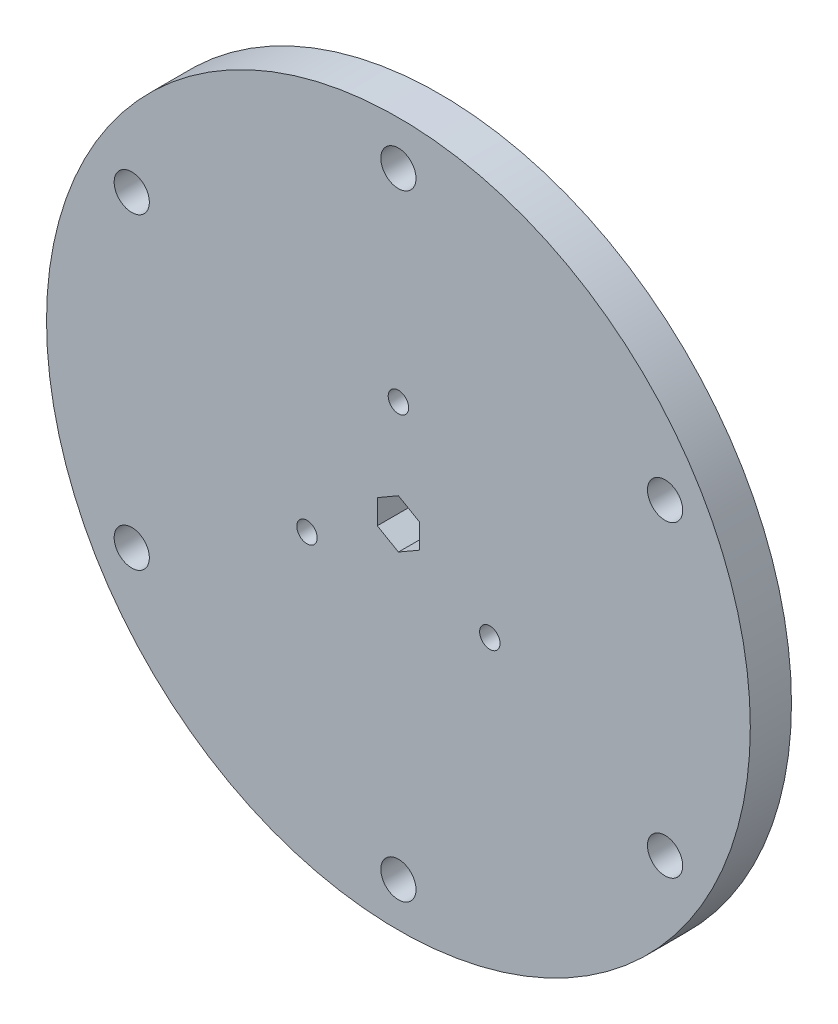
ISO-10303-21;
HEADER;
FILE_DESCRIPTION(('STEP AP214'),'2;1');
FILE_NAME('part.step','',(''),(''),'','','');
FILE_SCHEMA(('AUTOMOTIVE_DESIGN { 1 0 10303 214 1 1 1 1 }'));
ENDSEC;
DATA;
#1=APPLICATION_CONTEXT('core data for automotive mechanical design processes');
#2=APPLICATION_PROTOCOL_DEFINITION('international standard','automotive_design',2000,#1);
#3=PRODUCT_CONTEXT('',#1,'mechanical');
#4=PRODUCT('Part','Part','',(#3));
#5=PRODUCT_RELATED_PRODUCT_CATEGORY('part','',(#4));
#6=PRODUCT_DEFINITION_FORMATION('','',#4);
#7=PRODUCT_DEFINITION_CONTEXT('part definition',#1,'design');
#8=PRODUCT_DEFINITION('design','',#6,#7);
#9=PRODUCT_DEFINITION_SHAPE('','',#8);
#10=(LENGTH_UNIT() NAMED_UNIT(*) SI_UNIT(.MILLI.,.METRE.));
#11=(NAMED_UNIT(*) PLANE_ANGLE_UNIT() SI_UNIT($,.RADIAN.));
#12=(NAMED_UNIT(*) SI_UNIT($,.STERADIAN.) SOLID_ANGLE_UNIT());
#13=UNCERTAINTY_MEASURE_WITH_UNIT(LENGTH_MEASURE(1.E-05),#10,'distance_accuracy_value','');
#14=(GEOMETRIC_REPRESENTATION_CONTEXT(3) GLOBAL_UNCERTAINTY_ASSIGNED_CONTEXT((#13)) GLOBAL_UNIT_ASSIGNED_CONTEXT((#10,
#11,#12)) REPRESENTATION_CONTEXT('',''));
#15=CARTESIAN_POINT('',(0.,0.,0.));
#16=DIRECTION('',(0.,0.,1.));
#17=DIRECTION('',(1.,0.,0.));
#18=AXIS2_PLACEMENT_3D('',#15,#16,#17);
#19=CARTESIAN_POINT('',(0.,0.,2.9718));
#20=DIRECTION('',(0.,0.,-1.));
#21=DIRECTION('',(-1.,0.,0.));
#22=AXIS2_PLACEMENT_3D('',#19,#20,#21);
#23=CYLINDRICAL_SURFACE('',#22,50.8);
#24=CARTESIAN_POINT('',(0.,0.,2.9718));
#25=DIRECTION('',(0.,0.,1.));
#26=DIRECTION('',(1.,0.,0.));
#27=AXIS2_PLACEMENT_3D('',#24,#25,#26);
#28=CIRCLE('',#27,50.8);
#29=CARTESIAN_POINT('',(50.8,0.,2.9718));
#30=VERTEX_POINT('',#29);
#31=EDGE_CURVE('E11',#30,#30,#28,.T.);
#32=ORIENTED_EDGE('',*,*,#31,.F.);
#33=EDGE_LOOP('',(#32));
#34=FACE_BOUND('',#33,.T.);
#35=CARTESIAN_POINT('',(0.,0.,-2.9718));
#36=DIRECTION('',(0.,0.,1.));
#37=DIRECTION('',(1.,0.,0.));
#38=AXIS2_PLACEMENT_3D('',#35,#36,#37);
#39=CIRCLE('',#38,50.8);
#40=CARTESIAN_POINT('',(50.8,0.,-2.9718));
#41=VERTEX_POINT('',#40);
#42=EDGE_CURVE('E37',#41,#41,#39,.T.);
#43=ORIENTED_EDGE('',*,*,#42,.T.);
#44=EDGE_LOOP('',(#43));
#45=FACE_BOUND('',#44,.T.);
#46=ADVANCED_FACE('F34',(#34,#45),#23,.T.);
#47=CARTESIAN_POINT('',(0.,0.,2.9718));
#48=DIRECTION('',(0.,0.,1.));
#49=DIRECTION('',(1.,0.,0.));
#50=AXIS2_PLACEMENT_3D('',#47,#48,#49);
#51=PLANE('',#50);
#52=CARTESIAN_POINT('',(13.1982271536749,-7.61999999999988,2.9718));
#53=DIRECTION('',(0.,0.,1.));
#54=DIRECTION('',(1.,0.,0.));
#55=AXIS2_PLACEMENT_3D('',#52,#53,#54);
#56=CIRCLE('',#55,1.4732);
#57=CARTESIAN_POINT('',(14.6714271536749,-7.61999999999988,2.9718));
#58=VERTEX_POINT('',#57);
#59=EDGE_CURVE('E259',#58,#58,#56,.T.);
#60=ORIENTED_EDGE('',*,*,#59,.F.);
#61=EDGE_LOOP('',(#60));
#62=FACE_BOUND('',#61,.T.);
#63=CARTESIAN_POINT('',(-13.1982271536748,-7.62000000000006,2.9718));
#64=DIRECTION('',(0.,0.,1.));
#65=DIRECTION('',(1.,0.,0.));
#66=AXIS2_PLACEMENT_3D('',#63,#64,#65);
#67=CIRCLE('',#66,1.4732);
#68=CARTESIAN_POINT('',(-11.7250271536748,-7.62000000000006,2.9718));
#69=VERTEX_POINT('',#68);
#70=EDGE_CURVE('E261',#69,#69,#67,.T.);
#71=ORIENTED_EDGE('',*,*,#70,.F.);
#72=EDGE_LOOP('',(#71));
#73=FACE_BOUND('',#72,.T.);
#74=CARTESIAN_POINT('',(0.,15.24,2.9718));
#75=DIRECTION('',(0.,0.,1.));
#76=DIRECTION('',(1.,0.,0.));
#77=AXIS2_PLACEMENT_3D('',#74,#75,#76);
#78=CIRCLE('',#77,1.4732);
#79=CARTESIAN_POINT('',(1.4732,15.24,2.9718));
#80=VERTEX_POINT('',#79);
#81=EDGE_CURVE('E268',#80,#80,#78,.T.);
#82=ORIENTED_EDGE('',*,*,#81,.F.);
#83=EDGE_LOOP('',(#82));
#84=FACE_BOUND('',#83,.T.);
#85=DIRECTION('',(-0.866025403784439,-0.5,0.));
#86=VECTOR('',#85,1.);
#87=CARTESIAN_POINT('',(-3.048,1.75976362048998,2.9718));
#88=LINE('',#87,#86);
#89=CARTESIAN_POINT('',(0.,3.51952724097996,2.9718));
#90=VERTEX_POINT('',#89);
#91=CARTESIAN_POINT('',(-3.048,1.75976362048998,2.9718));
#92=VERTEX_POINT('',#91);
#93=EDGE_CURVE('E48',#90,#92,#88,.T.);
#94=ORIENTED_EDGE('',*,*,#93,.F.);
#95=DIRECTION('',(-0.866025403784439,0.5,0.));
#96=VECTOR('',#95,1.);
#97=CARTESIAN_POINT('',(0.,3.51952724097996,2.9718));
#98=LINE('',#97,#96);
#99=CARTESIAN_POINT('',(3.048,1.75976362048998,2.9718));
#100=VERTEX_POINT('',#99);
#101=EDGE_CURVE('E105',#100,#90,#98,.T.);
#102=ORIENTED_EDGE('',*,*,#101,.F.);
#103=DIRECTION('',(0.,1.,0.));
#104=VECTOR('',#103,1.);
#105=CARTESIAN_POINT('',(3.048,1.75976362048998,2.9718));
#106=LINE('',#105,#104);
#107=CARTESIAN_POINT('',(3.048,-1.75976362048998,2.9718));
#108=VERTEX_POINT('',#107);
#109=EDGE_CURVE('E108',#108,#100,#106,.T.);
#110=ORIENTED_EDGE('',*,*,#109,.F.);
#111=DIRECTION('',(0.866025403784439,0.5,0.));
#112=VECTOR('',#111,1.);
#113=CARTESIAN_POINT('',(3.048,-1.75976362048998,2.9718));
#114=LINE('',#113,#112);
#115=CARTESIAN_POINT('',(0.,-3.51952724097996,2.9718));
#116=VERTEX_POINT('',#115);
#117=EDGE_CURVE('E127',#116,#108,#114,.T.);
#118=ORIENTED_EDGE('',*,*,#117,.F.);
#119=DIRECTION('',(0.866025403784439,-0.5,0.));
#120=VECTOR('',#119,1.);
#121=CARTESIAN_POINT('',(0.,-3.51952724097996,2.9718));
#122=LINE('',#121,#120);
#123=CARTESIAN_POINT('',(-3.048,-1.75976362048998,2.9718));
#124=VERTEX_POINT('',#123);
#125=EDGE_CURVE('E124',#124,#116,#122,.T.);
#126=ORIENTED_EDGE('',*,*,#125,.F.);
#127=DIRECTION('',(0.,-1.,0.));
#128=VECTOR('',#127,1.);
#129=CARTESIAN_POINT('',(-3.048,-1.75976362048998,2.9718));
#130=LINE('',#129,#128);
#131=EDGE_CURVE('E122',#92,#124,#130,.T.);
#132=ORIENTED_EDGE('',*,*,#131,.F.);
#133=EDGE_LOOP('',(#94,#102,#110,#118,#126,#132));
#134=FACE_BOUND('',#133,.T.);
#135=CARTESIAN_POINT('',(-38.4948291982182,-22.2250000000002,2.9718));
#136=DIRECTION('',(0.,0.,1.));
#137=DIRECTION('',(-0.500000000000004,0.866025403784436,0.));
#138=AXIS2_PLACEMENT_3D('',#135,#136,#137);
#139=CIRCLE('',#138,2.54);
#140=CARTESIAN_POINT('',(-39.7648291982182,-20.0252954743877,2.9718));
#141=VERTEX_POINT('',#140);
#142=EDGE_CURVE('E146',#141,#141,#139,.T.);
#143=ORIENTED_EDGE('',*,*,#142,.F.);
#144=EDGE_LOOP('',(#143));
#145=FACE_BOUND('',#144,.T.);
#146=CARTESIAN_POINT('',(0.,-44.45,2.9718));
#147=DIRECTION('',(0.,0.,1.));
#148=DIRECTION('',(-1.,0.,0.));
#149=AXIS2_PLACEMENT_3D('',#146,#147,#148);
#150=CIRCLE('',#149,2.54);
#151=CARTESIAN_POINT('',(-2.54,-44.45,2.9718));
#152=VERTEX_POINT('',#151);
#153=EDGE_CURVE('E152',#152,#152,#150,.T.);
#154=ORIENTED_EDGE('',*,*,#153,.F.);
#155=EDGE_LOOP('',(#154));
#156=FACE_BOUND('',#155,.T.);
#157=CARTESIAN_POINT('',(38.4948291982185,-22.2249999999996,2.9718));
#158=DIRECTION('',(0.,0.,1.));
#159=DIRECTION('',(-0.499999999999992,-0.866025403784443,0.));
#160=AXIS2_PLACEMENT_3D('',#157,#158,#159);
#161=CIRCLE('',#160,2.54);
#162=CARTESIAN_POINT('',(37.2248291982185,-24.4247045256121,2.9718));
#163=VERTEX_POINT('',#162);
#164=EDGE_CURVE('E158',#163,#163,#161,.T.);
#165=ORIENTED_EDGE('',*,*,#164,.F.);
#166=EDGE_LOOP('',(#165));
#167=FACE_BOUND('',#166,.T.);
#168=CARTESIAN_POINT('',(38.494829198218,22.2250000000004,2.9718));
#169=DIRECTION('',(0.,0.,1.));
#170=DIRECTION('',(0.50000000000001,-0.866025403784433,0.));
#171=AXIS2_PLACEMENT_3D('',#168,#169,#170);
#172=CIRCLE('',#171,2.54);
#173=CARTESIAN_POINT('',(39.7648291982181,20.025295474388,2.9718));
#174=VERTEX_POINT('',#173);
#175=EDGE_CURVE('E134',#174,#174,#172,.T.);
#176=ORIENTED_EDGE('',*,*,#175,.F.);
#177=EDGE_LOOP('',(#176));
#178=FACE_BOUND('',#177,.T.);
#179=CARTESIAN_POINT('',(-38.4948291982183,22.2249999999999,2.9718));
#180=DIRECTION('',(0.,0.,1.));
#181=DIRECTION('',(0.499999999999998,0.86602540378444,0.));
#182=AXIS2_PLACEMENT_3D('',#179,#180,#181);
#183=CIRCLE('',#182,2.54);
#184=CARTESIAN_POINT('',(-37.2248291982184,24.4247045256124,2.9718));
#185=VERTEX_POINT('',#184);
#186=EDGE_CURVE('E145',#185,#185,#183,.T.);
#187=ORIENTED_EDGE('',*,*,#186,.F.);
#188=EDGE_LOOP('',(#187));
#189=FACE_BOUND('',#188,.T.);
#190=CARTESIAN_POINT('',(0.,44.45,2.9718));
#191=DIRECTION('',(0.,0.,1.));
#192=DIRECTION('',(1.,0.,0.));
#193=AXIS2_PLACEMENT_3D('',#190,#191,#192);
#194=CIRCLE('',#193,2.54);
#195=CARTESIAN_POINT('',(2.54,44.45,2.9718));
#196=VERTEX_POINT('',#195);
#197=EDGE_CURVE('E169',#196,#196,#194,.T.);
#198=ORIENTED_EDGE('',*,*,#197,.F.);
#199=EDGE_LOOP('',(#198));
#200=FACE_BOUND('',#199,.T.);
#201=ORIENTED_EDGE('',*,*,#31,.T.);
#202=EDGE_LOOP('',(#201));
#203=FACE_BOUND('',#202,.T.);
#204=ADVANCED_FACE('F180',(#62,#73,#84,#134,#145,#156,#167,#178,#189,#200,#203),#51,.T.);
#205=CARTESIAN_POINT('',(0.,0.,-2.9718));
#206=DIRECTION('',(0.,0.,1.));
#207=DIRECTION('',(1.,0.,0.));
#208=AXIS2_PLACEMENT_3D('',#205,#206,#207);
#209=PLANE('',#208);
#210=CARTESIAN_POINT('',(13.1982271536749,-7.61999999999988,-2.9718));
#211=DIRECTION('',(0.,0.,1.));
#212=DIRECTION('',(1.,0.,0.));
#213=AXIS2_PLACEMENT_3D('',#210,#211,#212);
#214=CIRCLE('',#213,1.4732);
#215=CARTESIAN_POINT('',(14.6714271536749,-7.61999999999988,-2.9718));
#216=VERTEX_POINT('',#215);
#217=EDGE_CURVE('E256',#216,#216,#214,.T.);
#218=ORIENTED_EDGE('',*,*,#217,.T.);
#219=EDGE_LOOP('',(#218));
#220=FACE_BOUND('',#219,.T.);
#221=CARTESIAN_POINT('',(-13.1982271536748,-7.62000000000006,-2.9718));
#222=DIRECTION('',(0.,0.,1.));
#223=DIRECTION('',(1.,0.,0.));
#224=AXIS2_PLACEMENT_3D('',#221,#222,#223);
#225=CIRCLE('',#224,1.4732);
#226=CARTESIAN_POINT('',(-11.7250271536748,-7.62000000000006,-2.9718));
#227=VERTEX_POINT('',#226);
#228=EDGE_CURVE('E266',#227,#227,#225,.T.);
#229=ORIENTED_EDGE('',*,*,#228,.T.);
#230=EDGE_LOOP('',(#229));
#231=FACE_BOUND('',#230,.T.);
#232=CARTESIAN_POINT('',(0.,15.24,-2.9718));
#233=DIRECTION('',(0.,0.,1.));
#234=DIRECTION('',(1.,0.,0.));
#235=AXIS2_PLACEMENT_3D('',#232,#233,#234);
#236=CIRCLE('',#235,1.4732);
#237=CARTESIAN_POINT('',(1.4732,15.24,-2.9718));
#238=VERTEX_POINT('',#237);
#239=EDGE_CURVE('E111',#238,#238,#236,.T.);
#240=ORIENTED_EDGE('',*,*,#239,.T.);
#241=EDGE_LOOP('',(#240));
#242=FACE_BOUND('',#241,.T.);
#243=DIRECTION('',(-0.866025403784439,0.5,0.));
#244=VECTOR('',#243,1.);
#245=CARTESIAN_POINT('',(0.,3.51952724097996,-2.9718));
#246=LINE('',#245,#244);
#247=CARTESIAN_POINT('',(3.048,1.75976362048998,-2.9718));
#248=VERTEX_POINT('',#247);
#249=CARTESIAN_POINT('',(0.,3.51952724097996,-2.9718));
#250=VERTEX_POINT('',#249);
#251=EDGE_CURVE('E94',#248,#250,#246,.T.);
#252=ORIENTED_EDGE('',*,*,#251,.T.);
#253=DIRECTION('',(-0.866025403784439,-0.5,0.));
#254=VECTOR('',#253,1.);
#255=CARTESIAN_POINT('',(-3.048,1.75976362048998,-2.9718));
#256=LINE('',#255,#254);
#257=CARTESIAN_POINT('',(-3.048,1.75976362048998,-2.9718));
#258=VERTEX_POINT('',#257);
#259=EDGE_CURVE('E88',#250,#258,#256,.T.);
#260=ORIENTED_EDGE('',*,*,#259,.T.);
#261=DIRECTION('',(0.,-1.,0.));
#262=VECTOR('',#261,1.);
#263=CARTESIAN_POINT('',(-3.048,-1.75976362048998,-2.9718));
#264=LINE('',#263,#262);
#265=CARTESIAN_POINT('',(-3.048,-1.75976362048998,-2.9718));
#266=VERTEX_POINT('',#265);
#267=EDGE_CURVE('E97',#258,#266,#264,.T.);
#268=ORIENTED_EDGE('',*,*,#267,.T.);
#269=DIRECTION('',(0.866025403784439,-0.5,0.));
#270=VECTOR('',#269,1.);
#271=CARTESIAN_POINT('',(0.,-3.51952724097996,-2.9718));
#272=LINE('',#271,#270);
#273=CARTESIAN_POINT('',(0.,-3.51952724097996,-2.9718));
#274=VERTEX_POINT('',#273);
#275=EDGE_CURVE('E56',#266,#274,#272,.T.);
#276=ORIENTED_EDGE('',*,*,#275,.T.);
#277=DIRECTION('',(0.866025403784439,0.5,0.));
#278=VECTOR('',#277,1.);
#279=CARTESIAN_POINT('',(3.048,-1.75976362048998,-2.9718));
#280=LINE('',#279,#278);
#281=CARTESIAN_POINT('',(3.048,-1.75976362048998,-2.9718));
#282=VERTEX_POINT('',#281);
#283=EDGE_CURVE('E115',#274,#282,#280,.T.);
#284=ORIENTED_EDGE('',*,*,#283,.T.);
#285=DIRECTION('',(0.,1.,0.));
#286=VECTOR('',#285,1.);
#287=CARTESIAN_POINT('',(3.048,1.75976362048998,-2.9718));
#288=LINE('',#287,#286);
#289=EDGE_CURVE('E118',#282,#248,#288,.T.);
#290=ORIENTED_EDGE('',*,*,#289,.T.);
#291=EDGE_LOOP('',(#252,#260,#268,#276,#284,#290));
#292=FACE_BOUND('',#291,.T.);
#293=CARTESIAN_POINT('',(-38.4948291982182,-22.2250000000002,-2.9718));
#294=DIRECTION('',(0.,0.,1.));
#295=DIRECTION('',(-0.500000000000004,0.866025403784436,0.));
#296=AXIS2_PLACEMENT_3D('',#293,#294,#295);
#297=CIRCLE('',#296,2.54);
#298=CARTESIAN_POINT('',(-39.7648291982182,-20.0252954743877,-2.9718));
#299=VERTEX_POINT('',#298);
#300=EDGE_CURVE('E142',#299,#299,#297,.T.);
#301=ORIENTED_EDGE('',*,*,#300,.T.);
#302=EDGE_LOOP('',(#301));
#303=FACE_BOUND('',#302,.T.);
#304=CARTESIAN_POINT('',(0.,-44.45,-2.9718));
#305=DIRECTION('',(0.,0.,1.));
#306=DIRECTION('',(-1.,0.,0.));
#307=AXIS2_PLACEMENT_3D('',#304,#305,#306);
#308=CIRCLE('',#307,2.54);
#309=CARTESIAN_POINT('',(-2.54,-44.45,-2.9718));
#310=VERTEX_POINT('',#309);
#311=EDGE_CURVE('E149',#310,#310,#308,.T.);
#312=ORIENTED_EDGE('',*,*,#311,.T.);
#313=EDGE_LOOP('',(#312));
#314=FACE_BOUND('',#313,.T.);
#315=CARTESIAN_POINT('',(38.4948291982185,-22.2249999999996,-2.9718));
#316=DIRECTION('',(0.,0.,1.));
#317=DIRECTION('',(-0.499999999999992,-0.866025403784443,0.));
#318=AXIS2_PLACEMENT_3D('',#315,#316,#317);
#319=CIRCLE('',#318,2.54);
#320=CARTESIAN_POINT('',(37.2248291982185,-24.4247045256121,-2.9718));
#321=VERTEX_POINT('',#320);
#322=EDGE_CURVE('E155',#321,#321,#319,.T.);
#323=ORIENTED_EDGE('',*,*,#322,.T.);
#324=EDGE_LOOP('',(#323));
#325=FACE_BOUND('',#324,.T.);
#326=CARTESIAN_POINT('',(38.494829198218,22.2250000000004,-2.9718));
#327=DIRECTION('',(0.,0.,1.));
#328=DIRECTION('',(0.50000000000001,-0.866025403784433,0.));
#329=AXIS2_PLACEMENT_3D('',#326,#327,#328);
#330=CIRCLE('',#329,2.54);
#331=CARTESIAN_POINT('',(39.7648291982181,20.025295474388,-2.9718));
#332=VERTEX_POINT('',#331);
#333=EDGE_CURVE('E161',#332,#332,#330,.T.);
#334=ORIENTED_EDGE('',*,*,#333,.T.);
#335=EDGE_LOOP('',(#334));
#336=FACE_BOUND('',#335,.T.);
#337=CARTESIAN_POINT('',(-38.4948291982183,22.2249999999999,-2.9718));
#338=DIRECTION('',(0.,0.,1.));
#339=DIRECTION('',(0.499999999999998,0.86602540378444,0.));
#340=AXIS2_PLACEMENT_3D('',#337,#338,#339);
#341=CIRCLE('',#340,2.54);
#342=CARTESIAN_POINT('',(-37.2248291982184,24.4247045256124,-2.9718));
#343=VERTEX_POINT('',#342);
#344=EDGE_CURVE('E166',#343,#343,#341,.T.);
#345=ORIENTED_EDGE('',*,*,#344,.T.);
#346=EDGE_LOOP('',(#345));
#347=FACE_BOUND('',#346,.T.);
#348=CARTESIAN_POINT('',(0.,44.45,-2.9718));
#349=DIRECTION('',(0.,0.,1.));
#350=DIRECTION('',(1.,0.,0.));
#351=AXIS2_PLACEMENT_3D('',#348,#349,#350);
#352=CIRCLE('',#351,2.54);
#353=CARTESIAN_POINT('',(2.54,44.45,-2.9718));
#354=VERTEX_POINT('',#353);
#355=EDGE_CURVE('E172',#354,#354,#352,.T.);
#356=ORIENTED_EDGE('',*,*,#355,.T.);
#357=EDGE_LOOP('',(#356));
#358=FACE_BOUND('',#357,.T.);
#359=ORIENTED_EDGE('',*,*,#42,.F.);
#360=EDGE_LOOP('',(#359));
#361=FACE_BOUND('',#360,.T.);
#362=ADVANCED_FACE('F101',(#220,#231,#242,#292,#303,#314,#325,#336,#347,#358,#361),#209,.F.);
#363=CARTESIAN_POINT('',(0.,44.45,-2.9718));
#364=DIRECTION('',(0.,0.,1.));
#365=DIRECTION('',(1.,0.,0.));
#366=AXIS2_PLACEMENT_3D('',#363,#364,#365);
#367=CYLINDRICAL_SURFACE('',#366,2.54);
#368=ORIENTED_EDGE('',*,*,#355,.F.);
#369=EDGE_LOOP('',(#368));
#370=FACE_BOUND('',#369,.T.);
#371=ORIENTED_EDGE('',*,*,#197,.T.);
#372=EDGE_LOOP('',(#371));
#373=FACE_BOUND('',#372,.T.);
#374=ADVANCED_FACE('F178',(#370,#373),#367,.F.);
#375=CARTESIAN_POINT('',(-38.4948291982183,22.2249999999999,-2.9718));
#376=DIRECTION('',(0.,0.,1.));
#377=DIRECTION('',(1.,0.,0.));
#378=AXIS2_PLACEMENT_3D('',#375,#376,#377);
#379=CYLINDRICAL_SURFACE('',#378,2.54);
#380=ORIENTED_EDGE('',*,*,#344,.F.);
#381=EDGE_LOOP('',(#380));
#382=FACE_BOUND('',#381,.T.);
#383=ORIENTED_EDGE('',*,*,#186,.T.);
#384=EDGE_LOOP('',(#383));
#385=FACE_BOUND('',#384,.T.);
#386=ADVANCED_FACE('F197',(#382,#385),#379,.F.);
#387=CARTESIAN_POINT('',(38.494829198218,22.2250000000004,-2.9718));
#388=DIRECTION('',(0.,0.,1.));
#389=DIRECTION('',(1.,0.,0.));
#390=AXIS2_PLACEMENT_3D('',#387,#388,#389);
#391=CYLINDRICAL_SURFACE('',#390,2.54);
#392=ORIENTED_EDGE('',*,*,#333,.F.);
#393=EDGE_LOOP('',(#392));
#394=FACE_BOUND('',#393,.T.);
#395=ORIENTED_EDGE('',*,*,#175,.T.);
#396=EDGE_LOOP('',(#395));
#397=FACE_BOUND('',#396,.T.);
#398=ADVANCED_FACE('F205',(#394,#397),#391,.F.);
#399=CARTESIAN_POINT('',(38.4948291982185,-22.2249999999996,-2.9718));
#400=DIRECTION('',(0.,0.,1.));
#401=DIRECTION('',(1.,0.,0.));
#402=AXIS2_PLACEMENT_3D('',#399,#400,#401);
#403=CYLINDRICAL_SURFACE('',#402,2.54);
#404=ORIENTED_EDGE('',*,*,#322,.F.);
#405=EDGE_LOOP('',(#404));
#406=FACE_BOUND('',#405,.T.);
#407=ORIENTED_EDGE('',*,*,#164,.T.);
#408=EDGE_LOOP('',(#407));
#409=FACE_BOUND('',#408,.T.);
#410=ADVANCED_FACE('F209',(#406,#409),#403,.F.);
#411=CARTESIAN_POINT('',(0.,-44.45,-2.9718));
#412=DIRECTION('',(0.,0.,1.));
#413=DIRECTION('',(1.,0.,0.));
#414=AXIS2_PLACEMENT_3D('',#411,#412,#413);
#415=CYLINDRICAL_SURFACE('',#414,2.54);
#416=ORIENTED_EDGE('',*,*,#311,.F.);
#417=EDGE_LOOP('',(#416));
#418=FACE_BOUND('',#417,.T.);
#419=ORIENTED_EDGE('',*,*,#153,.T.);
#420=EDGE_LOOP('',(#419));
#421=FACE_BOUND('',#420,.T.);
#422=ADVANCED_FACE('F213',(#418,#421),#415,.F.);
#423=CARTESIAN_POINT('',(-38.4948291982182,-22.2250000000002,-2.9718));
#424=DIRECTION('',(0.,0.,1.));
#425=DIRECTION('',(1.,0.,0.));
#426=AXIS2_PLACEMENT_3D('',#423,#424,#425);
#427=CYLINDRICAL_SURFACE('',#426,2.54);
#428=ORIENTED_EDGE('',*,*,#300,.F.);
#429=EDGE_LOOP('',(#428));
#430=FACE_BOUND('',#429,.T.);
#431=ORIENTED_EDGE('',*,*,#142,.T.);
#432=EDGE_LOOP('',(#431));
#433=FACE_BOUND('',#432,.T.);
#434=ADVANCED_FACE('F217',(#430,#433),#427,.F.);
#435=CARTESIAN_POINT('',(-3.048,1.75976362048998,-2.9718));
#436=DIRECTION('',(-0.5,0.866025403784438,0.));
#437=DIRECTION('',(-0.866025403784439,-0.5,0.));
#438=AXIS2_PLACEMENT_3D('',#435,#436,#437);
#439=PLANE('',#438);
#440=ORIENTED_EDGE('',*,*,#93,.T.);
#441=DIRECTION('',(0.,0.,1.));
#442=VECTOR('',#441,1.);
#443=CARTESIAN_POINT('',(-3.048,1.75976362048998,-2.9718));
#444=LINE('',#443,#442);
#445=EDGE_CURVE('E84',#258,#92,#444,.T.);
#446=ORIENTED_EDGE('',*,*,#445,.F.);
#447=ORIENTED_EDGE('',*,*,#259,.F.);
#448=DIRECTION('',(0.,0.,1.));
#449=VECTOR('',#448,1.);
#450=CARTESIAN_POINT('',(0.,3.51952724097996,-2.9718));
#451=LINE('',#450,#449);
#452=EDGE_CURVE('E132',#250,#90,#451,.T.);
#453=ORIENTED_EDGE('',*,*,#452,.T.);
#454=EDGE_LOOP('',(#440,#446,#447,#453));
#455=FACE_BOUND('',#454,.T.);
#456=ADVANCED_FACE('F86',(#455),#439,.F.);
#457=CARTESIAN_POINT('',(0.,3.51952724097996,-2.9718));
#458=DIRECTION('',(0.5,0.866025403784438,0.));
#459=DIRECTION('',(-0.866025403784439,0.5,0.));
#460=AXIS2_PLACEMENT_3D('',#457,#458,#459);
#461=PLANE('',#460);
#462=ORIENTED_EDGE('',*,*,#101,.T.);
#463=ORIENTED_EDGE('',*,*,#452,.F.);
#464=ORIENTED_EDGE('',*,*,#251,.F.);
#465=DIRECTION('',(0.,0.,1.));
#466=VECTOR('',#465,1.);
#467=CARTESIAN_POINT('',(3.048,1.75976362048998,-2.9718));
#468=LINE('',#467,#466);
#469=EDGE_CURVE('E135',#248,#100,#468,.T.);
#470=ORIENTED_EDGE('',*,*,#469,.T.);
#471=EDGE_LOOP('',(#462,#463,#464,#470));
#472=FACE_BOUND('',#471,.T.);
#473=ADVANCED_FACE('F224',(#472),#461,.F.);
#474=CARTESIAN_POINT('',(3.048,1.75976362048998,-2.9718));
#475=DIRECTION('',(1.,0.,0.));
#476=DIRECTION('',(0.,0.,-1.));
#477=AXIS2_PLACEMENT_3D('',#474,#475,#476);
#478=PLANE('',#477);
#479=ORIENTED_EDGE('',*,*,#109,.T.);
#480=ORIENTED_EDGE('',*,*,#469,.F.);
#481=ORIENTED_EDGE('',*,*,#289,.F.);
#482=DIRECTION('',(0.,0.,1.));
#483=VECTOR('',#482,1.);
#484=CARTESIAN_POINT('',(3.048,-1.75976362048998,-2.9718));
#485=LINE('',#484,#483);
#486=EDGE_CURVE('E137',#282,#108,#485,.T.);
#487=ORIENTED_EDGE('',*,*,#486,.T.);
#488=EDGE_LOOP('',(#479,#480,#481,#487));
#489=FACE_BOUND('',#488,.T.);
#490=ADVANCED_FACE('F234',(#489),#478,.F.);
#491=CARTESIAN_POINT('',(3.048,-1.75976362048998,-2.9718));
#492=DIRECTION('',(0.5,-0.866025403784438,0.));
#493=DIRECTION('',(0.866025403784439,0.5,0.));
#494=AXIS2_PLACEMENT_3D('',#491,#492,#493);
#495=PLANE('',#494);
#496=ORIENTED_EDGE('',*,*,#117,.T.);
#497=ORIENTED_EDGE('',*,*,#486,.F.);
#498=ORIENTED_EDGE('',*,*,#283,.F.);
#499=DIRECTION('',(0.,0.,1.));
#500=VECTOR('',#499,1.);
#501=CARTESIAN_POINT('',(0.,-3.51952724097996,-2.9718));
#502=LINE('',#501,#500);
#503=EDGE_CURVE('E139',#274,#116,#502,.T.);
#504=ORIENTED_EDGE('',*,*,#503,.T.);
#505=EDGE_LOOP('',(#496,#497,#498,#504));
#506=FACE_BOUND('',#505,.T.);
#507=ADVANCED_FACE('F231',(#506),#495,.F.);
#508=CARTESIAN_POINT('',(0.,-3.51952724097996,-2.9718));
#509=DIRECTION('',(-0.5,-0.866025403784438,0.));
#510=DIRECTION('',(0.866025403784439,-0.5,0.));
#511=AXIS2_PLACEMENT_3D('',#508,#509,#510);
#512=PLANE('',#511);
#513=ORIENTED_EDGE('',*,*,#125,.T.);
#514=ORIENTED_EDGE('',*,*,#503,.F.);
#515=ORIENTED_EDGE('',*,*,#275,.F.);
#516=DIRECTION('',(0.,0.,1.));
#517=VECTOR('',#516,1.);
#518=CARTESIAN_POINT('',(-3.048,-1.75976362048998,-2.9718));
#519=LINE('',#518,#517);
#520=EDGE_CURVE('E93',#266,#124,#519,.T.);
#521=ORIENTED_EDGE('',*,*,#520,.T.);
#522=EDGE_LOOP('',(#513,#514,#515,#521));
#523=FACE_BOUND('',#522,.T.);
#524=ADVANCED_FACE('F228',(#523),#512,.F.);
#525=CARTESIAN_POINT('',(-3.048,-1.75976362048998,-2.9718));
#526=DIRECTION('',(-1.,0.,0.));
#527=DIRECTION('',(0.,0.,1.));
#528=AXIS2_PLACEMENT_3D('',#525,#526,#527);
#529=PLANE('',#528);
#530=ORIENTED_EDGE('',*,*,#131,.T.);
#531=ORIENTED_EDGE('',*,*,#520,.F.);
#532=ORIENTED_EDGE('',*,*,#267,.F.);
#533=ORIENTED_EDGE('',*,*,#445,.T.);
#534=EDGE_LOOP('',(#530,#531,#532,#533));
#535=FACE_BOUND('',#534,.T.);
#536=ADVANCED_FACE('F98',(#535),#529,.F.);
#537=CARTESIAN_POINT('',(0.,15.24,2.9718));
#538=DIRECTION('',(0.,0.,1.));
#539=DIRECTION('',(1.,0.,0.));
#540=AXIS2_PLACEMENT_3D('',#537,#538,#539);
#541=CYLINDRICAL_SURFACE('',#540,1.4732);
#542=ORIENTED_EDGE('',*,*,#239,.F.);
#543=EDGE_LOOP('',(#542));
#544=FACE_BOUND('',#543,.T.);
#545=ORIENTED_EDGE('',*,*,#81,.T.);
#546=EDGE_LOOP('',(#545));
#547=FACE_BOUND('',#546,.T.);
#548=ADVANCED_FACE('F227',(#544,#547),#541,.F.);
#549=CARTESIAN_POINT('',(-13.1982271536748,-7.62000000000006,2.9718));
#550=DIRECTION('',(0.,0.,1.));
#551=DIRECTION('',(1.,0.,0.));
#552=AXIS2_PLACEMENT_3D('',#549,#550,#551);
#553=CYLINDRICAL_SURFACE('',#552,1.4732);
#554=ORIENTED_EDGE('',*,*,#228,.F.);
#555=EDGE_LOOP('',(#554));
#556=FACE_BOUND('',#555,.T.);
#557=ORIENTED_EDGE('',*,*,#70,.T.);
#558=EDGE_LOOP('',(#557));
#559=FACE_BOUND('',#558,.T.);
#560=ADVANCED_FACE('F244',(#556,#559),#553,.F.);
#561=CARTESIAN_POINT('',(13.1982271536749,-7.61999999999988,2.9718));
#562=DIRECTION('',(0.,0.,1.));
#563=DIRECTION('',(1.,0.,0.));
#564=AXIS2_PLACEMENT_3D('',#561,#562,#563);
#565=CYLINDRICAL_SURFACE('',#564,1.4732);
#566=ORIENTED_EDGE('',*,*,#217,.F.);
#567=EDGE_LOOP('',(#566));
#568=FACE_BOUND('',#567,.T.);
#569=ORIENTED_EDGE('',*,*,#59,.T.);
#570=EDGE_LOOP('',(#569));
#571=FACE_BOUND('',#570,.T.);
#572=ADVANCED_FACE('F248',(#568,#571),#565,.F.);
#573=CLOSED_SHELL('',(#46,#204,#362,#374,#386,#398,#410,#422,#434,#456,#473,#490,#507,#524,#536,
#548,#560,#572));
#574=MANIFOLD_SOLID_BREP('B2',#573);
#575=ADVANCED_BREP_SHAPE_REPRESENTATION('',(#18,#574),#14);
#576=SHAPE_DEFINITION_REPRESENTATION(#9,#575);
ENDSEC;
END-ISO-10303-21;
